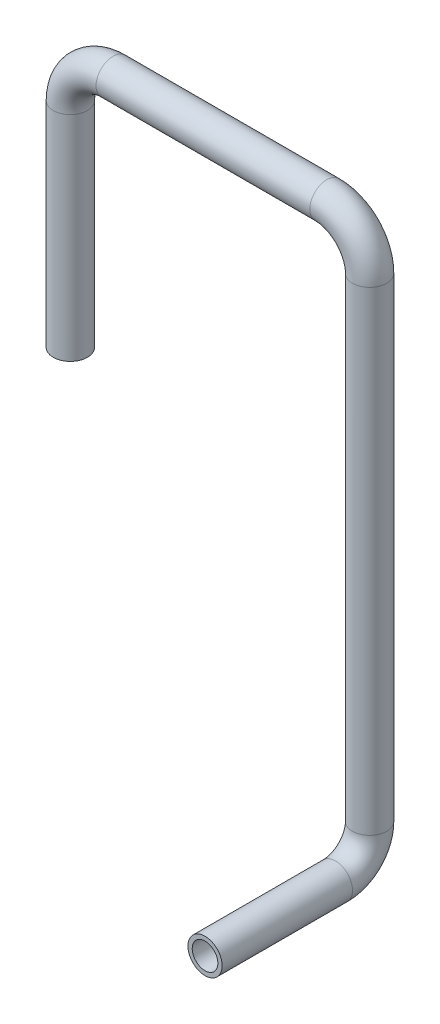
ISO-10303-21;
HEADER;
FILE_DESCRIPTION(('STEP AP214'),'2;1');
FILE_NAME('part.step','',(''),(''),'','','');
FILE_SCHEMA(('AUTOMOTIVE_DESIGN { 1 0 10303 214 1 1 1 1 }'));
ENDSEC;
DATA;
#1=APPLICATION_CONTEXT('core data for automotive mechanical design processes');
#2=APPLICATION_PROTOCOL_DEFINITION('international standard','automotive_design',2000,#1);
#3=PRODUCT_CONTEXT('',#1,'mechanical');
#4=PRODUCT('Part','Part','',(#3));
#5=PRODUCT_RELATED_PRODUCT_CATEGORY('part','',(#4));
#6=PRODUCT_DEFINITION_FORMATION('','',#4);
#7=PRODUCT_DEFINITION_CONTEXT('part definition',#1,'design');
#8=PRODUCT_DEFINITION('design','',#6,#7);
#9=PRODUCT_DEFINITION_SHAPE('','',#8);
#10=(LENGTH_UNIT() NAMED_UNIT(*) SI_UNIT(.MILLI.,.METRE.));
#11=(NAMED_UNIT(*) PLANE_ANGLE_UNIT() SI_UNIT($,.RADIAN.));
#12=(NAMED_UNIT(*) SI_UNIT($,.STERADIAN.) SOLID_ANGLE_UNIT());
#13=UNCERTAINTY_MEASURE_WITH_UNIT(LENGTH_MEASURE(1.E-05),#10,'distance_accuracy_value','');
#14=(GEOMETRIC_REPRESENTATION_CONTEXT(3) GLOBAL_UNCERTAINTY_ASSIGNED_CONTEXT((#13)) GLOBAL_UNIT_ASSIGNED_CONTEXT((#10,
#11,#12)) REPRESENTATION_CONTEXT('',''));
#15=CARTESIAN_POINT('',(0.,0.,0.));
#16=DIRECTION('',(0.,0.,1.));
#17=DIRECTION('',(1.,0.,0.));
#18=AXIS2_PLACEMENT_3D('',#15,#16,#17);
#19=CARTESIAN_POINT('',(180.,21.,-79.5));
#20=DIRECTION('',(0.,0.,1.));
#21=DIRECTION('',(0.,1.,0.));
#22=AXIS2_PLACEMENT_3D('',#19,#20,#21);
#23=PLANE('',#22);
#24=CARTESIAN_POINT('',(180.,21.,-79.5));
#25=DIRECTION('',(0.,0.,1.));
#26=DIRECTION('',(0.,1.,0.));
#27=AXIS2_PLACEMENT_3D('',#24,#25,#26);
#28=CIRCLE('',#27,3.);
#29=CARTESIAN_POINT('',(180.,24.,-79.5));
#30=VERTEX_POINT('',#29);
#31=EDGE_CURVE('E263',#30,#30,#28,.T.);
#32=ORIENTED_EDGE('',*,*,#31,.F.);
#33=EDGE_LOOP('',(#32));
#34=FACE_BOUND('',#33,.T.);
#35=CARTESIAN_POINT('',(180.,21.,-79.5));
#36=DIRECTION('',(0.,0.,1.));
#37=DIRECTION('',(1.,0.,0.));
#38=AXIS2_PLACEMENT_3D('',#35,#36,#37);
#39=CIRCLE('',#38,4.);
#40=CARTESIAN_POINT('',(184.,21.,-79.5));
#41=VERTEX_POINT('',#40);
#42=EDGE_CURVE('E75',#41,#41,#39,.T.);
#43=ORIENTED_EDGE('',*,*,#42,.T.);
#44=EDGE_LOOP('',(#43));
#45=FACE_BOUND('',#44,.T.);
#46=ADVANCED_FACE('F52',(#34,#45),#23,.T.);
#47=CARTESIAN_POINT('',(110.,90.,-118.));
#48=DIRECTION('',(0.,1.,0.));
#49=DIRECTION('',(0.,0.,1.));
#50=AXIS2_PLACEMENT_3D('',#47,#48,#49);
#51=PLANE('',#50);
#52=CARTESIAN_POINT('',(110.,90.,-118.));
#53=DIRECTION('',(0.,1.,0.));
#54=DIRECTION('',(0.,0.,1.));
#55=AXIS2_PLACEMENT_3D('',#52,#53,#54);
#56=CIRCLE('',#55,3.);
#57=CARTESIAN_POINT('',(110.,90.,-115.));
#58=VERTEX_POINT('',#57);
#59=EDGE_CURVE('E73',#58,#58,#56,.T.);
#60=ORIENTED_EDGE('',*,*,#59,.T.);
#61=EDGE_LOOP('',(#60));
#62=FACE_BOUND('',#61,.T.);
#63=CARTESIAN_POINT('',(110.,90.,-118.));
#64=DIRECTION('',(0.,1.,0.));
#65=DIRECTION('',(0.,0.,1.));
#66=AXIS2_PLACEMENT_3D('',#63,#64,#65);
#67=CIRCLE('',#66,4.);
#68=CARTESIAN_POINT('',(110.,90.,-114.));
#69=VERTEX_POINT('',#68);
#70=EDGE_CURVE('E11',#69,#69,#67,.T.);
#71=ORIENTED_EDGE('',*,*,#70,.F.);
#72=EDGE_LOOP('',(#71));
#73=FACE_BOUND('',#72,.T.);
#74=ADVANCED_FACE('F149',(#62,#73),#51,.F.);
#75=CARTESIAN_POINT('',(180.,21.,-79.5));
#76=DIRECTION('',(0.,0.,-1.));
#77=DIRECTION('',(-1.,0.,0.));
#78=AXIS2_PLACEMENT_3D('',#75,#76,#77);
#79=CYLINDRICAL_SURFACE('',#78,4.);
#80=CARTESIAN_POINT('',(180.,21.,-110.));
#81=DIRECTION('',(0.,0.,-1.));
#82=DIRECTION('',(-1.,0.,0.));
#83=AXIS2_PLACEMENT_3D('',#80,#81,#82);
#84=CIRCLE('',#83,4.);
#85=CARTESIAN_POINT('',(180.,17.,-110.));
#86=VERTEX_POINT('',#85);
#87=EDGE_CURVE('E74',#86,#86,#84,.F.);
#88=ORIENTED_EDGE('',*,*,#87,.T.);
#89=EDGE_LOOP('',(#88));
#90=FACE_BOUND('',#89,.T.);
#91=ORIENTED_EDGE('',*,*,#42,.F.);
#92=EDGE_LOOP('',(#91));
#93=FACE_BOUND('',#92,.T.);
#94=ADVANCED_FACE('F155',(#90,#93),#79,.T.);
#95=CARTESIAN_POINT('',(180.,29.,-110.));
#96=DIRECTION('',(1.,0.,0.));
#97=DIRECTION('',(0.,0.,-1.));
#98=AXIS2_PLACEMENT_3D('',#95,#96,#97);
#99=TOROIDAL_SURFACE('',#98,8.,4.);
#100=CARTESIAN_POINT('',(180.,29.,-118.));
#101=DIRECTION('',(0.,-1.,0.));
#102=DIRECTION('',(0.,0.,-1.));
#103=AXIS2_PLACEMENT_3D('',#100,#101,#102);
#104=CIRCLE('',#103,4.);
#105=CARTESIAN_POINT('',(180.,29.,-122.));
#106=VERTEX_POINT('',#105);
#107=EDGE_CURVE('E78',#106,#106,#104,.T.);
#108=CARTESIAN_POINT('',(180.,29.,-110.));
#109=DIRECTION('',(1.,0.,0.));
#110=DIRECTION('',(0.,0.,-1.));
#111=AXIS2_PLACEMENT_3D('',#108,#109,#110);
#112=CIRCLE('',#111,12.);
#113=EDGE_CURVE('',#86,#106,#112,.T.);
#114=ORIENTED_EDGE('',*,*,#87,.F.);
#115=ORIENTED_EDGE('',*,*,#107,.T.);
#116=ORIENTED_EDGE('',*,*,#113,.T.);
#117=ORIENTED_EDGE('',*,*,#113,.F.);
#118=EDGE_LOOP('',(#114,#116,#115,#117));
#119=FACE_BOUND('',#118,.T.);
#120=ADVANCED_FACE('F158',(#119),#99,.T.);
#121=CARTESIAN_POINT('',(180.,29.,-118.));
#122=DIRECTION('',(0.,1.,0.));
#123=DIRECTION('',(0.,0.,1.));
#124=AXIS2_PLACEMENT_3D('',#121,#122,#123);
#125=CYLINDRICAL_SURFACE('',#124,4.);
#126=CARTESIAN_POINT('',(180.,140.,-118.));
#127=DIRECTION('',(0.,1.,0.));
#128=DIRECTION('',(0.,0.,1.));
#129=AXIS2_PLACEMENT_3D('',#126,#127,#128);
#130=CIRCLE('',#129,4.);
#131=CARTESIAN_POINT('',(184.,140.,-118.));
#132=VERTEX_POINT('',#131);
#133=EDGE_CURVE('E91',#132,#132,#130,.F.);
#134=ORIENTED_EDGE('',*,*,#133,.T.);
#135=EDGE_LOOP('',(#134));
#136=FACE_BOUND('',#135,.T.);
#137=ORIENTED_EDGE('',*,*,#107,.F.);
#138=EDGE_LOOP('',(#137));
#139=FACE_BOUND('',#138,.T.);
#140=ADVANCED_FACE('F109',(#136,#139),#125,.T.);
#141=CARTESIAN_POINT('',(170.,140.,-118.));
#142=DIRECTION('',(0.,0.,1.));
#143=DIRECTION('',(1.,0.,0.));
#144=AXIS2_PLACEMENT_3D('',#141,#142,#143);
#145=TOROIDAL_SURFACE('',#144,10.,4.);
#146=CARTESIAN_POINT('',(170.,150.,-118.));
#147=DIRECTION('',(1.,0.,0.));
#148=DIRECTION('',(0.,1.,0.));
#149=AXIS2_PLACEMENT_3D('',#146,#147,#148);
#150=CIRCLE('',#149,4.);
#151=CARTESIAN_POINT('',(170.,154.,-118.));
#152=VERTEX_POINT('',#151);
#153=EDGE_CURVE('E68',#152,#152,#150,.T.);
#154=CARTESIAN_POINT('',(170.,140.,-118.));
#155=DIRECTION('',(0.,0.,1.));
#156=DIRECTION('',(1.,0.,0.));
#157=AXIS2_PLACEMENT_3D('',#154,#155,#156);
#158=CIRCLE('',#157,14.);
#159=EDGE_CURVE('',#132,#152,#158,.T.);
#160=ORIENTED_EDGE('',*,*,#133,.F.);
#161=ORIENTED_EDGE('',*,*,#153,.T.);
#162=ORIENTED_EDGE('',*,*,#159,.T.);
#163=ORIENTED_EDGE('',*,*,#159,.F.);
#164=EDGE_LOOP('',(#160,#162,#161,#163));
#165=FACE_BOUND('',#164,.T.);
#166=ADVANCED_FACE('F98',(#165),#145,.T.);
#167=CARTESIAN_POINT('',(170.,150.,-118.));
#168=DIRECTION('',(-1.,0.,0.));
#169=DIRECTION('',(0.,0.,1.));
#170=AXIS2_PLACEMENT_3D('',#167,#168,#169);
#171=CYLINDRICAL_SURFACE('',#170,4.);
#172=CARTESIAN_POINT('',(120.,150.,-118.));
#173=DIRECTION('',(-1.,0.,0.));
#174=DIRECTION('',(0.,0.,1.));
#175=AXIS2_PLACEMENT_3D('',#172,#173,#174);
#176=CIRCLE('',#175,4.);
#177=CARTESIAN_POINT('',(120.,154.,-118.));
#178=VERTEX_POINT('',#177);
#179=EDGE_CURVE('E63',#178,#178,#176,.F.);
#180=ORIENTED_EDGE('',*,*,#179,.T.);
#181=EDGE_LOOP('',(#180));
#182=FACE_BOUND('',#181,.T.);
#183=ORIENTED_EDGE('',*,*,#153,.F.);
#184=EDGE_LOOP('',(#183));
#185=FACE_BOUND('',#184,.T.);
#186=ADVANCED_FACE('F101',(#182,#185),#171,.T.);
#187=CARTESIAN_POINT('',(120.,140.,-118.));
#188=DIRECTION('',(0.,0.,1.));
#189=DIRECTION('',(1.,0.,0.));
#190=AXIS2_PLACEMENT_3D('',#187,#188,#189);
#191=TOROIDAL_SURFACE('',#190,10.,4.);
#192=CARTESIAN_POINT('',(110.,140.,-118.));
#193=DIRECTION('',(0.,1.,0.));
#194=DIRECTION('',(-1.,0.,0.));
#195=AXIS2_PLACEMENT_3D('',#192,#193,#194);
#196=CIRCLE('',#195,4.);
#197=CARTESIAN_POINT('',(106.,140.,-118.));
#198=VERTEX_POINT('',#197);
#199=EDGE_CURVE('E58',#198,#198,#196,.T.);
#200=CARTESIAN_POINT('',(120.,140.,-118.));
#201=DIRECTION('',(0.,0.,1.));
#202=DIRECTION('',(1.,0.,0.));
#203=AXIS2_PLACEMENT_3D('',#200,#201,#202);
#204=CIRCLE('',#203,14.);
#205=EDGE_CURVE('',#178,#198,#204,.T.);
#206=ORIENTED_EDGE('',*,*,#179,.F.);
#207=ORIENTED_EDGE('',*,*,#199,.T.);
#208=ORIENTED_EDGE('',*,*,#205,.T.);
#209=ORIENTED_EDGE('',*,*,#205,.F.);
#210=EDGE_LOOP('',(#206,#208,#207,#209));
#211=FACE_BOUND('',#210,.T.);
#212=ADVANCED_FACE('F103',(#211),#191,.T.);
#213=CARTESIAN_POINT('',(110.,140.,-118.));
#214=DIRECTION('',(0.,-1.,0.));
#215=DIRECTION('',(0.,0.,-1.));
#216=AXIS2_PLACEMENT_3D('',#213,#214,#215);
#217=CYLINDRICAL_SURFACE('',#216,4.);
#218=ORIENTED_EDGE('',*,*,#70,.T.);
#219=EDGE_LOOP('',(#218));
#220=FACE_BOUND('',#219,.T.);
#221=ORIENTED_EDGE('',*,*,#199,.F.);
#222=EDGE_LOOP('',(#221));
#223=FACE_BOUND('',#222,.T.);
#224=ADVANCED_FACE('F54',(#220,#223),#217,.T.);
#225=CARTESIAN_POINT('',(180.,21.,-79.5));
#226=DIRECTION('',(0.,0.,-1.));
#227=DIRECTION('',(-1.,0.,0.));
#228=AXIS2_PLACEMENT_3D('',#225,#226,#227);
#229=CYLINDRICAL_SURFACE('',#228,3.);
#230=CARTESIAN_POINT('',(180.,21.,-110.));
#231=DIRECTION('',(0.,0.,1.));
#232=DIRECTION('',(0.,1.,0.));
#233=AXIS2_PLACEMENT_3D('',#230,#231,#232);
#234=CIRCLE('',#233,3.);
#235=CARTESIAN_POINT('',(180.,18.,-110.));
#236=VERTEX_POINT('',#235);
#237=EDGE_CURVE('E262',#236,#236,#234,.T.);
#238=ORIENTED_EDGE('',*,*,#237,.F.);
#239=EDGE_LOOP('',(#238));
#240=FACE_BOUND('',#239,.T.);
#241=ORIENTED_EDGE('',*,*,#31,.T.);
#242=EDGE_LOOP('',(#241));
#243=FACE_BOUND('',#242,.T.);
#244=ADVANCED_FACE('F114',(#240,#243),#229,.F.);
#245=CARTESIAN_POINT('',(180.,29.,-110.));
#246=DIRECTION('',(1.,0.,0.));
#247=DIRECTION('',(0.,0.,-1.));
#248=AXIS2_PLACEMENT_3D('',#245,#246,#247);
#249=TOROIDAL_SURFACE('',#248,8.,3.);
#250=CARTESIAN_POINT('',(180.,29.,-118.));
#251=DIRECTION('',(0.,-1.,0.));
#252=DIRECTION('',(0.,0.,1.));
#253=AXIS2_PLACEMENT_3D('',#250,#251,#252);
#254=CIRCLE('',#253,3.);
#255=CARTESIAN_POINT('',(180.,29.,-121.));
#256=VERTEX_POINT('',#255);
#257=EDGE_CURVE('E270',#256,#256,#254,.T.);
#258=CARTESIAN_POINT('',(180.,29.,-110.));
#259=DIRECTION('',(1.,0.,0.));
#260=DIRECTION('',(0.,0.,-1.));
#261=AXIS2_PLACEMENT_3D('',#258,#259,#260);
#262=CIRCLE('',#261,11.);
#263=EDGE_CURVE('',#236,#256,#262,.T.);
#264=ORIENTED_EDGE('',*,*,#237,.T.);
#265=ORIENTED_EDGE('',*,*,#257,.F.);
#266=ORIENTED_EDGE('',*,*,#263,.T.);
#267=ORIENTED_EDGE('',*,*,#263,.F.);
#268=EDGE_LOOP('',(#264,#266,#265,#267));
#269=FACE_BOUND('',#268,.T.);
#270=ADVANCED_FACE('F116',(#269),#249,.F.);
#271=CARTESIAN_POINT('',(180.,29.,-118.));
#272=DIRECTION('',(0.,1.,0.));
#273=DIRECTION('',(0.,0.,1.));
#274=AXIS2_PLACEMENT_3D('',#271,#272,#273);
#275=CYLINDRICAL_SURFACE('',#274,3.);
#276=CARTESIAN_POINT('',(180.,140.,-118.));
#277=DIRECTION('',(0.,-1.,0.));
#278=DIRECTION('',(0.,0.,1.));
#279=AXIS2_PLACEMENT_3D('',#276,#277,#278);
#280=CIRCLE('',#279,3.);
#281=CARTESIAN_POINT('',(183.,140.,-118.));
#282=VERTEX_POINT('',#281);
#283=EDGE_CURVE('E275',#282,#282,#280,.T.);
#284=ORIENTED_EDGE('',*,*,#283,.F.);
#285=EDGE_LOOP('',(#284));
#286=FACE_BOUND('',#285,.T.);
#287=ORIENTED_EDGE('',*,*,#257,.T.);
#288=EDGE_LOOP('',(#287));
#289=FACE_BOUND('',#288,.T.);
#290=ADVANCED_FACE('F123',(#286,#289),#275,.F.);
#291=CARTESIAN_POINT('',(170.,140.,-118.));
#292=DIRECTION('',(0.,0.,1.));
#293=DIRECTION('',(1.,0.,0.));
#294=AXIS2_PLACEMENT_3D('',#291,#292,#293);
#295=TOROIDAL_SURFACE('',#294,10.,3.);
#296=CARTESIAN_POINT('',(170.,150.,-118.));
#297=DIRECTION('',(1.,0.,0.));
#298=DIRECTION('',(0.,0.,1.));
#299=AXIS2_PLACEMENT_3D('',#296,#297,#298);
#300=CIRCLE('',#299,3.);
#301=CARTESIAN_POINT('',(170.,153.,-118.));
#302=VERTEX_POINT('',#301);
#303=EDGE_CURVE('E274',#302,#302,#300,.T.);
#304=CARTESIAN_POINT('',(170.,140.,-118.));
#305=DIRECTION('',(0.,0.,1.));
#306=DIRECTION('',(1.,0.,0.));
#307=AXIS2_PLACEMENT_3D('',#304,#305,#306);
#308=CIRCLE('',#307,13.);
#309=EDGE_CURVE('',#282,#302,#308,.T.);
#310=ORIENTED_EDGE('',*,*,#283,.T.);
#311=ORIENTED_EDGE('',*,*,#303,.F.);
#312=ORIENTED_EDGE('',*,*,#309,.T.);
#313=ORIENTED_EDGE('',*,*,#309,.F.);
#314=EDGE_LOOP('',(#310,#312,#311,#313));
#315=FACE_BOUND('',#314,.T.);
#316=ADVANCED_FACE('F131',(#315),#295,.F.);
#317=CARTESIAN_POINT('',(170.,150.,-118.));
#318=DIRECTION('',(-1.,0.,0.));
#319=DIRECTION('',(0.,0.,1.));
#320=AXIS2_PLACEMENT_3D('',#317,#318,#319);
#321=CYLINDRICAL_SURFACE('',#320,3.);
#322=CARTESIAN_POINT('',(120.,150.,-118.));
#323=DIRECTION('',(1.,0.,0.));
#324=DIRECTION('',(0.,0.,1.));
#325=AXIS2_PLACEMENT_3D('',#322,#323,#324);
#326=CIRCLE('',#325,3.);
#327=CARTESIAN_POINT('',(120.,153.,-118.));
#328=VERTEX_POINT('',#327);
#329=EDGE_CURVE('E87',#328,#328,#326,.T.);
#330=ORIENTED_EDGE('',*,*,#329,.F.);
#331=EDGE_LOOP('',(#330));
#332=FACE_BOUND('',#331,.T.);
#333=ORIENTED_EDGE('',*,*,#303,.T.);
#334=EDGE_LOOP('',(#333));
#335=FACE_BOUND('',#334,.T.);
#336=ADVANCED_FACE('F136',(#332,#335),#321,.F.);
#337=CARTESIAN_POINT('',(120.,140.,-118.));
#338=DIRECTION('',(0.,0.,1.));
#339=DIRECTION('',(1.,0.,0.));
#340=AXIS2_PLACEMENT_3D('',#337,#338,#339);
#341=TOROIDAL_SURFACE('',#340,10.,3.);
#342=CARTESIAN_POINT('',(110.,140.,-118.));
#343=DIRECTION('',(0.,1.,0.));
#344=DIRECTION('',(0.,0.,1.));
#345=AXIS2_PLACEMENT_3D('',#342,#343,#344);
#346=CIRCLE('',#345,3.);
#347=CARTESIAN_POINT('',(107.,140.,-118.));
#348=VERTEX_POINT('',#347);
#349=EDGE_CURVE('E85',#348,#348,#346,.T.);
#350=CARTESIAN_POINT('',(120.,140.,-118.));
#351=DIRECTION('',(0.,0.,1.));
#352=DIRECTION('',(1.,0.,0.));
#353=AXIS2_PLACEMENT_3D('',#350,#351,#352);
#354=CIRCLE('',#353,13.);
#355=EDGE_CURVE('',#328,#348,#354,.T.);
#356=ORIENTED_EDGE('',*,*,#329,.T.);
#357=ORIENTED_EDGE('',*,*,#349,.F.);
#358=ORIENTED_EDGE('',*,*,#355,.T.);
#359=ORIENTED_EDGE('',*,*,#355,.F.);
#360=EDGE_LOOP('',(#356,#358,#357,#359));
#361=FACE_BOUND('',#360,.T.);
#362=ADVANCED_FACE('F139',(#361),#341,.F.);
#363=CARTESIAN_POINT('',(110.,140.,-118.));
#364=DIRECTION('',(0.,-1.,0.));
#365=DIRECTION('',(0.,0.,-1.));
#366=AXIS2_PLACEMENT_3D('',#363,#364,#365);
#367=CYLINDRICAL_SURFACE('',#366,3.);
#368=ORIENTED_EDGE('',*,*,#59,.F.);
#369=EDGE_LOOP('',(#368));
#370=FACE_BOUND('',#369,.T.);
#371=ORIENTED_EDGE('',*,*,#349,.T.);
#372=EDGE_LOOP('',(#371));
#373=FACE_BOUND('',#372,.T.);
#374=ADVANCED_FACE('F145',(#370,#373),#367,.F.);
#375=CLOSED_SHELL('',(#46,#74,#94,#120,#140,#166,#186,#212,#224,#244,#270,#290,#316,#336,#362,#374));
#376=MANIFOLD_SOLID_BREP('B2',#375);
#377=ADVANCED_BREP_SHAPE_REPRESENTATION('',(#18,#376),#14);
#378=SHAPE_DEFINITION_REPRESENTATION(#9,#377);
ENDSEC;
END-ISO-10303-21;
